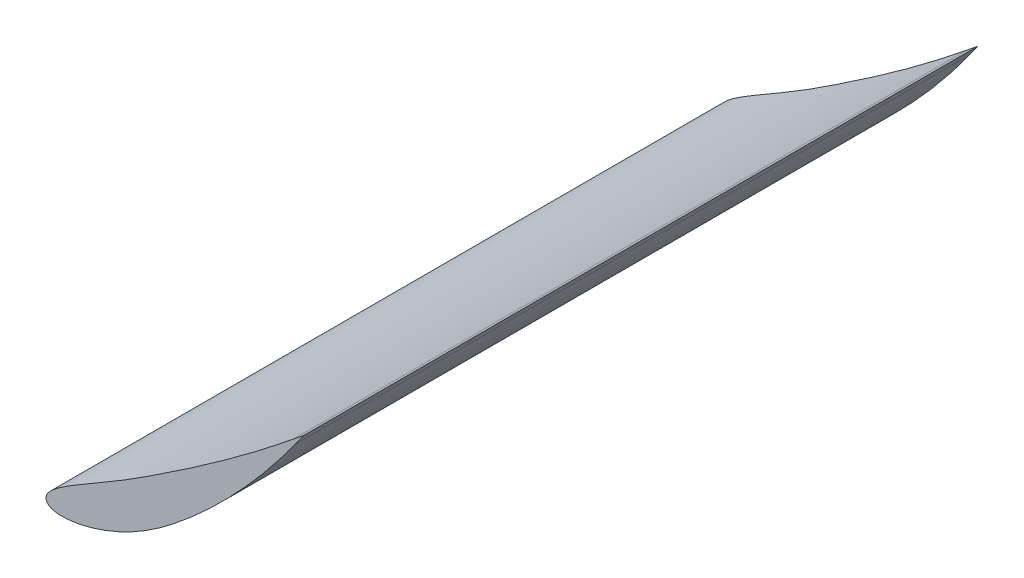
ISO-10303-21;
HEADER;
FILE_DESCRIPTION(('STEP AP214'),'2;1');
FILE_NAME('part.step','',(''),(''),'','','');
FILE_SCHEMA(('AUTOMOTIVE_DESIGN { 1 0 10303 214 1 1 1 1 }'));
ENDSEC;
DATA;
#1=APPLICATION_CONTEXT('core data for automotive mechanical design processes');
#2=APPLICATION_PROTOCOL_DEFINITION('international standard','automotive_design',2000,#1);
#3=PRODUCT_CONTEXT('',#1,'mechanical');
#4=PRODUCT('Part','Part','',(#3));
#5=PRODUCT_RELATED_PRODUCT_CATEGORY('part','',(#4));
#6=PRODUCT_DEFINITION_FORMATION('','',#4);
#7=PRODUCT_DEFINITION_CONTEXT('part definition',#1,'design');
#8=PRODUCT_DEFINITION('design','',#6,#7);
#9=PRODUCT_DEFINITION_SHAPE('','',#8);
#10=(LENGTH_UNIT() NAMED_UNIT(*) SI_UNIT(.MILLI.,.METRE.));
#11=(NAMED_UNIT(*) PLANE_ANGLE_UNIT() SI_UNIT($,.RADIAN.));
#12=(NAMED_UNIT(*) SI_UNIT($,.STERADIAN.) SOLID_ANGLE_UNIT());
#13=UNCERTAINTY_MEASURE_WITH_UNIT(LENGTH_MEASURE(1.E-05),#10,'distance_accuracy_value','');
#14=(GEOMETRIC_REPRESENTATION_CONTEXT(3) GLOBAL_UNCERTAINTY_ASSIGNED_CONTEXT((#13)) GLOBAL_UNIT_ASSIGNED_CONTEXT((#10,
#11,#12)) REPRESENTATION_CONTEXT('',''));
#15=CARTESIAN_POINT('',(0.,0.,0.));
#16=DIRECTION('',(0.,0.,1.));
#17=DIRECTION('',(1.,0.,0.));
#18=AXIS2_PLACEMENT_3D('',#15,#16,#17);
#19=CARTESIAN_POINT('',(164.392253256989,119.437963265831,431.8));
#20=DIRECTION('',(-0.811249289421057,0.584700427923419,0.));
#21=DIRECTION('',(-0.584700427923419,-0.811249289421057,0.));
#22=AXIS2_PLACEMENT_3D('',#19,#20,#21);
#23=PLANE('',#22);
#24=DIRECTION('',(0.584700427923419,0.811249289421057,0.));
#25=VECTOR('',#24,1.);
#26=CARTESIAN_POINT('',(164.392253256989,119.437963265831,0.));
#27=LINE('',#26,#25);
#28=CARTESIAN_POINT('',(158.910857997575,111.832738783564,0.));
#29=VERTEX_POINT('',#28);
#30=CARTESIAN_POINT('',(164.392253256989,119.437963265831,0.));
#31=VERTEX_POINT('',#30);
#32=EDGE_CURVE('E84',#29,#31,#27,.T.);
#33=ORIENTED_EDGE('',*,*,#32,.T.);
#34=DIRECTION('',(0.,0.,-1.));
#35=VECTOR('',#34,1.);
#36=CARTESIAN_POINT('',(164.392253256989,119.437963265831,431.8));
#37=LINE('',#36,#35);
#38=CARTESIAN_POINT('',(164.392253256989,119.437963265831,431.8));
#39=VERTEX_POINT('',#38);
#40=EDGE_CURVE('E11',#39,#31,#37,.T.);
#41=ORIENTED_EDGE('',*,*,#40,.F.);
#42=DIRECTION('',(0.584700427923419,0.811249289421057,0.));
#43=VECTOR('',#42,1.);
#44=CARTESIAN_POINT('',(164.392253256989,119.437963265831,431.8));
#45=LINE('',#44,#43);
#46=CARTESIAN_POINT('',(158.910857997575,111.832738783564,431.8));
#47=VERTEX_POINT('',#46);
#48=EDGE_CURVE('E77',#47,#39,#45,.T.);
#49=ORIENTED_EDGE('',*,*,#48,.F.);
#50=DIRECTION('',(0.,0.,-1.));
#51=VECTOR('',#50,1.);
#52=CARTESIAN_POINT('',(158.910857997575,111.832738783564,431.8));
#53=LINE('',#52,#51);
#54=EDGE_CURVE('E85',#47,#29,#53,.T.);
#55=ORIENTED_EDGE('',*,*,#54,.T.);
#56=EDGE_LOOP('',(#33,#41,#49,#55));
#57=FACE_BOUND('',#56,.T.);
#58=ADVANCED_FACE('F33',(#57),#23,.F.);
#59=CARTESIAN_POINT('',(157.468061094507,113.860792095652,431.8));
#60=DIRECTION('',(0.627285179942655,-0.778789639777206,0.));
#61=DIRECTION('',(0.778789639777206,0.627285179942655,0.));
#62=AXIS2_PLACEMENT_3D('',#59,#60,#61);
#63=PLANE('',#62);
#64=DIRECTION('',(-0.778789639777206,-0.627285179942655,0.));
#65=VECTOR('',#64,1.);
#66=CARTESIAN_POINT('',(157.468061094507,113.860792095652,0.));
#67=LINE('',#66,#65);
#68=CARTESIAN_POINT('',(157.468061094507,113.860792095652,0.));
#69=VERTEX_POINT('',#68);
#70=EDGE_CURVE('E64',#31,#69,#67,.T.);
#71=ORIENTED_EDGE('',*,*,#70,.T.);
#72=DIRECTION('',(0.,0.,-1.));
#73=VECTOR('',#72,1.);
#74=CARTESIAN_POINT('',(157.468061094507,113.860792095652,431.8));
#75=LINE('',#74,#73);
#76=CARTESIAN_POINT('',(157.468061094507,113.860792095652,431.8));
#77=VERTEX_POINT('',#76);
#78=EDGE_CURVE('E42',#77,#69,#75,.T.);
#79=ORIENTED_EDGE('',*,*,#78,.F.);
#80=DIRECTION('',(-0.778789639777206,-0.627285179942655,0.));
#81=VECTOR('',#80,1.);
#82=CARTESIAN_POINT('',(157.468061094507,113.860792095652,431.8));
#83=LINE('',#82,#81);
#84=EDGE_CURVE('E73',#39,#77,#83,.T.);
#85=ORIENTED_EDGE('',*,*,#84,.F.);
#86=ORIENTED_EDGE('',*,*,#40,.T.);
#87=EDGE_LOOP('',(#71,#79,#85,#86));
#88=FACE_BOUND('',#87,.T.);
#89=ADVANCED_FACE('F74',(#88),#63,.F.);
#90=CARTESIAN_POINT('',(157.468061094507,113.860792095652,431.8));
#91=CARTESIAN_POINT('',(155.838244249807,112.548037148124,431.8));
#92=CARTESIAN_POINT('',(154.207109491914,111.236941951689,431.8));
#93=CARTESIAN_POINT('',(150.935955142281,108.625940924506,431.8));
#94=CARTESIAN_POINT('',(149.296894116793,107.324827896361,431.8));
#95=CARTESIAN_POINT('',(144.3679662017,103.436280005174,431.8));
#96=CARTESIAN_POINT('',(141.066534858547,100.862937729253,431.8));
#97=CARTESIAN_POINT('',(131.119225282403,93.208887615958,431.8));
#98=CARTESIAN_POINT('',(124.427043210012,88.1950699424169,431.8));
#99=CARTESIAN_POINT('',(110.919196079604,78.348421372226,431.8));
#100=CARTESIAN_POINT('',(104.102895739599,73.5165215968871,431.8));
#101=CARTESIAN_POINT('',(90.3627199300965,64.0103929663063,431.8));
#102=CARTESIAN_POINT('',(83.4386673583005,59.3364236866989,431.8));
#103=CARTESIAN_POINT('',(73.0036397537534,52.3972130595375,431.8));
#104=CARTESIAN_POINT('',(69.5155707582138,50.0983987478608,431.8));
#105=CARTESIAN_POINT('',(64.2827711397147,46.6511975784364,431.8));
#106=CARTESIAN_POINT('',(62.5377824260821,45.5031889995164,431.8));
#107=CARTESIAN_POINT('',(59.0317675069052,43.2306777032786,431.8));
#108=CARTESIAN_POINT('',(57.2701955434438,42.1069748934625,431.8));
#109=CARTESIAN_POINT('',(51.9631490833563,38.7685959758256,431.8));
#110=CARTESIAN_POINT('',(48.3955320414995,36.5863737957518,431.8));
#111=CARTESIAN_POINT('',(41.2176445038925,32.2844458309126,431.8));
#112=CARTESIAN_POINT('',(37.6072124241526,30.164960489286,431.8));
#113=CARTESIAN_POINT('',(30.3704088138894,25.9494179184367,431.8));
#114=CARTESIAN_POINT('',(26.7439115716706,23.8547630738792,431.8));
#115=CARTESIAN_POINT('',(21.3275085472376,20.674960123274,431.8));
#116=CARTESIAN_POINT('',(19.526130398029,19.6083998490711,431.8));
#117=CARTESIAN_POINT('',(15.9429685471408,17.4435318595348,431.8));
#118=CARTESIAN_POINT('',(14.1607582138398,16.3459153840162,431.8));
#119=CARTESIAN_POINT('',(10.6364572105112,14.0856794954843,431.8));
#120=CARTESIAN_POINT('',(8.89318892283987,12.9249680896635,431.8));
#121=CARTESIAN_POINT('',(6.34539141965264,11.075175804667,431.8));
#122=CARTESIAN_POINT('',(5.50552298067806,10.4392660062206,431.8));
#123=CARTESIAN_POINT('',(3.87825321833517,9.11471453779397,431.8));
#124=CARTESIAN_POINT('',(3.0880036746821,8.42781382122424,431.8));
#125=CARTESIAN_POINT('',(1.97396469564981,7.32234596004794,431.8));
#126=CARTESIAN_POINT('',(1.6141433744502,6.94172073318779,431.8));
#127=CARTESIAN_POINT('',(0.930757304232876,6.14229176485067,431.8));
#128=CARTESIAN_POINT('',(0.605717377019353,5.71933499032045,431.8));
#129=CARTESIAN_POINT('',(0.0271482798685967,4.83403759399345,431.8));
#130=CARTESIAN_POINT('',(-0.226083699572971,4.37156952524479,431.8));
#131=CARTESIAN_POINT('',(-0.508234487138487,3.62415983085207,431.8));
#132=CARTESIAN_POINT('',(-0.585180280244843,3.3679212292073,431.8));
#133=CARTESIAN_POINT('',(-0.695316095914738,2.85072278821754,431.8));
#134=CARTESIAN_POINT('',(-0.729122567624853,2.58822372617473,431.8));
#135=CARTESIAN_POINT('',(-0.743022093009579,2.05337331280405,431.8));
#136=CARTESIAN_POINT('',(-0.7221915819007,1.78762282828528,431.8));
#137=CARTESIAN_POINT('',(-0.621623484133317,1.26952072283121,431.8));
#138=CARTESIAN_POINT('',(-0.541704332119032,1.0127369411627,431.8));
#139=CARTESIAN_POINT('',(-0.33175729073043,0.523081744422784,431.8));
#140=CARTESIAN_POINT('',(-0.20328706056936,0.291888774146802,431.8));
#141=CARTESIAN_POINT('',(0.0986625771133347,-0.144379322326652,431.8));
#142=CARTESIAN_POINT('',(0.273873379225597,-0.349869020660226,431.8));
#143=CARTESIAN_POINT('',(0.651108001795617,-0.721974329350371,431.8));
#144=CARTESIAN_POINT('',(0.854486148790219,-0.890971488281604,431.8));
#145=CARTESIAN_POINT('',(1.28519739954158,-1.20128690887801,431.8));
#146=CARTESIAN_POINT('',(1.51311285258183,-1.34293342947332,431.8));
#147=CARTESIAN_POINT('',(2.21105864853725,-1.72377303371843,431.8));
#148=CARTESIAN_POINT('',(2.70083601771336,-1.92240530870184,431.8));
#149=CARTESIAN_POINT('',(3.71043442050406,-2.2518502054561,431.8));
#150=CARTESIAN_POINT('',(4.22618496415132,-2.38116367984013,431.8));
#151=CARTESIAN_POINT('',(5.26308558305631,-2.58656443356782,431.8));
#152=CARTESIAN_POINT('',(5.78603261217279,-2.66399796110731,431.8));
#153=CARTESIAN_POINT('',(6.83828950899693,-2.78311253527516,431.8));
#154=CARTESIAN_POINT('',(7.36823397887924,-2.82392166804276,431.8));
#155=CARTESIAN_POINT('',(8.42297093110776,-2.87640465835309,431.8));
#156=CARTESIAN_POINT('',(8.94926091892882,-2.88865896781911,431.8));
#157=CARTESIAN_POINT('',(10.525508866839,-2.8914163176165,431.8));
#158=CARTESIAN_POINT('',(11.5728412463359,-2.8478675434574,431.8));
#159=CARTESIAN_POINT('',(13.6626655190764,-2.69799251254851,431.8));
#160=CARTESIAN_POINT('',(14.705068864797,-2.59051786071742,431.8));
#161=CARTESIAN_POINT('',(16.7860082830142,-2.32541291880544,431.8));
#162=CARTESIAN_POINT('',(17.8245151647431,-2.1674040463162,431.8));
#163=CARTESIAN_POINT('',(19.8981776322375,-1.8079225018375,431.8));
#164=CARTESIAN_POINT('',(20.9334772701192,-1.60656097457819,431.8));
#165=CARTESIAN_POINT('',(24.0168342761845,-0.94896759567361,431.8));
#166=CARTESIAN_POINT('',(26.0492811976918,-0.439097516502388,431.8));
#167=CARTESIAN_POINT('',(32.0899519377952,1.26567222772899,431.8));
#168=CARTESIAN_POINT('',(36.0420522311614,2.63404224321699,431.8));
#169=CARTESIAN_POINT('',(41.8788925912185,4.96882457681439,431.8));
#170=CARTESIAN_POINT('',(43.8119429935888,5.79614070409062,431.8));
#171=CARTESIAN_POINT('',(47.6353874669602,7.53492212804651,431.8));
#172=CARTESIAN_POINT('',(49.5210623664358,8.44408839800671,431.8));
#173=CARTESIAN_POINT('',(55.1056901539949,11.2821408319546,431.8));
#174=CARTESIAN_POINT('',(58.7324353378502,13.3212916922179,431.8));
#175=CARTESIAN_POINT('',(65.8130963319883,17.6635123198495,431.8));
#176=CARTESIAN_POINT('',(69.2671684904961,19.9663433358309,431.8));
#177=CARTESIAN_POINT('',(76.0148092322926,24.8171021779162,431.8));
#178=CARTESIAN_POINT('',(79.301584899193,27.3754031196094,431.8));
#179=CARTESIAN_POINT('',(84.1779853694685,31.2949533088022,431.8));
#180=CARTESIAN_POINT('',(85.7928071713274,32.6177255071486,431.8));
#181=CARTESIAN_POINT('',(89.0003331811582,35.2970445515515,431.8));
#182=CARTESIAN_POINT('',(90.5921240680383,36.6525068731581,431.8));
#183=CARTESIAN_POINT('',(98.4773217467177,43.4875724221723,431.8));
#184=CARTESIAN_POINT('',(104.568115369873,49.1545537694427,431.8));
#185=CARTESIAN_POINT('',(116.378873198927,60.8278942572071,431.8));
#186=CARTESIAN_POINT('',(122.098231746913,66.8348076871842,431.8));
#187=CARTESIAN_POINT('',(133.196506361703,79.1602026499015,431.8));
#188=CARTESIAN_POINT('',(138.57488037448,85.4791802627562,431.8));
#189=CARTESIAN_POINT('',(146.391356471631,95.1874360212316,431.8));
#190=CARTESIAN_POINT('',(148.954675272111,98.4621176143427,431.8));
#191=CARTESIAN_POINT('',(152.73616863268,103.432240424179,431.8));
#192=CARTESIAN_POINT('',(153.986024632667,105.098687239007,431.8));
#193=CARTESIAN_POINT('',(156.464325589675,108.451175949785,431.8));
#194=CARTESIAN_POINT('',(157.690394330957,110.139392524482,431.8));
#195=CARTESIAN_POINT('',(158.910857997575,111.832738783564,431.8));
#196=B_SPLINE_CURVE_WITH_KNOTS('',3,(#90,#91,#92,#93,#94,#95,#96,#97,#98,#99,#100,#101,#102,
#103,#104,#105,#106,#107,#108,#109,#110,#111,#112,#113,#114,#115,#116,#117,#118,#119,#120,#121,
#122,#123,#124,#125,#126,#127,#128,#129,#130,#131,#132,#133,#134,#135,#136,#137,#138,#139,#140,
#141,#142,#143,#144,#145,#146,#147,#148,#149,#150,#151,#152,#153,#154,#155,#156,#157,#158,#159,
#160,#161,#162,#163,#164,#165,#166,#167,#168,#169,#170,#171,#172,#173,#174,#175,#176,#177,#178,
#179,#180,#181,#182,#183,#184,#185,#186,#187,#188,#189,#190,#191,#192,#193,#194,#195),
.UNSPECIFIED.,.F.,.F.,(4,2,2,2,2,2,2,2,2,2,2,2,2,2,2,2,2,2,2,2,2,2,2,2,2,2,2,2,2,2,2,2,2,2,2,2,
2,2,2,2,2,2,2,2,2,2,2,2,2,2,2,2,4),(0.,0.0156250000000021,0.0312500000000041,0.0625000000000074,
0.125000000000013,0.187500000000019,0.250000000000025,0.281250000000028,0.29687500000003,
0.312500000000031,0.343750000000034,0.375000000000038,0.406250000000041,0.421875000000042,
0.437500000000043,0.453125000000045,0.460937500000045,0.468750000000046,0.472656250000046,
0.476562500000047,0.480468750000047,0.482421875000047,0.484375000000047,0.486328125000047,
0.488281250000047,0.490234375000047,0.492187500000047,0.494140625000047,0.496093750000047,
0.500000000000047,0.503906250000047,0.507812500000047,0.511718750000046,0.515625000000046,
0.523437500000045,0.531250000000044,0.539062500000044,0.546875000000043,0.562500000000041,
0.593750000000038,0.609375000000036,0.625000000000034,0.656250000000031,0.687500000000028,
0.718750000000026,0.734375000000024,0.750000000000023,0.812500000000017,0.875000000000011,
0.937500000000006,0.968750000000003,0.984375000000001,1.),.UNSPECIFIED.);
#197=DIRECTION('',(0.,0.,-1.));
#198=VECTOR('',#197,1.);
#199=SURFACE_OF_LINEAR_EXTRUSION('',#196,#198);
#200=CARTESIAN_POINT('',(157.468061094507,113.860792095652,0.));
#201=CARTESIAN_POINT('',(155.838244249807,112.548037148124,0.));
#202=CARTESIAN_POINT('',(154.207109491914,111.236941951689,0.));
#203=CARTESIAN_POINT('',(150.935955142281,108.625940924506,0.));
#204=CARTESIAN_POINT('',(149.296894116793,107.324827896361,0.));
#205=CARTESIAN_POINT('',(144.3679662017,103.436280005174,0.));
#206=CARTESIAN_POINT('',(141.066534858547,100.862937729253,0.));
#207=CARTESIAN_POINT('',(131.119225282403,93.208887615958,0.));
#208=CARTESIAN_POINT('',(124.427043210012,88.1950699424169,0.));
#209=CARTESIAN_POINT('',(110.919196079604,78.348421372226,0.));
#210=CARTESIAN_POINT('',(104.102895739599,73.5165215968871,0.));
#211=CARTESIAN_POINT('',(90.3627199300965,64.0103929663063,0.));
#212=CARTESIAN_POINT('',(83.4386673583005,59.3364236866989,0.));
#213=CARTESIAN_POINT('',(73.0036397537534,52.3972130595375,0.));
#214=CARTESIAN_POINT('',(69.5155707582138,50.0983987478608,0.));
#215=CARTESIAN_POINT('',(64.2827711397147,46.6511975784364,0.));
#216=CARTESIAN_POINT('',(62.5377824260821,45.5031889995164,0.));
#217=CARTESIAN_POINT('',(59.0317675069052,43.2306777032786,0.));
#218=CARTESIAN_POINT('',(57.2701955434438,42.1069748934625,0.));
#219=CARTESIAN_POINT('',(51.9631490833563,38.7685959758256,0.));
#220=CARTESIAN_POINT('',(48.3955320414995,36.5863737957518,0.));
#221=CARTESIAN_POINT('',(41.2176445038925,32.2844458309126,0.));
#222=CARTESIAN_POINT('',(37.6072124241526,30.164960489286,0.));
#223=CARTESIAN_POINT('',(30.3704088138894,25.9494179184367,0.));
#224=CARTESIAN_POINT('',(26.7439115716706,23.8547630738792,0.));
#225=CARTESIAN_POINT('',(21.3275085472376,20.674960123274,0.));
#226=CARTESIAN_POINT('',(19.526130398029,19.6083998490711,0.));
#227=CARTESIAN_POINT('',(15.9429685471408,17.4435318595348,0.));
#228=CARTESIAN_POINT('',(14.1607582138398,16.3459153840162,0.));
#229=CARTESIAN_POINT('',(10.6364572105112,14.0856794954843,0.));
#230=CARTESIAN_POINT('',(8.89318892283987,12.9249680896635,0.));
#231=CARTESIAN_POINT('',(6.34539141965264,11.075175804667,0.));
#232=CARTESIAN_POINT('',(5.50552298067806,10.4392660062206,0.));
#233=CARTESIAN_POINT('',(3.87825321833517,9.11471453779397,0.));
#234=CARTESIAN_POINT('',(3.0880036746821,8.42781382122424,0.));
#235=CARTESIAN_POINT('',(1.97396469564981,7.32234596004794,0.));
#236=CARTESIAN_POINT('',(1.6141433744502,6.94172073318779,0.));
#237=CARTESIAN_POINT('',(0.930757304232876,6.14229176485067,0.));
#238=CARTESIAN_POINT('',(0.605717377019353,5.71933499032045,0.));
#239=CARTESIAN_POINT('',(0.0271482798685967,4.83403759399345,0.));
#240=CARTESIAN_POINT('',(-0.226083699572971,4.37156952524479,0.));
#241=CARTESIAN_POINT('',(-0.508234487138487,3.62415983085207,0.));
#242=CARTESIAN_POINT('',(-0.585180280244843,3.3679212292073,0.));
#243=CARTESIAN_POINT('',(-0.695316095914738,2.85072278821754,0.));
#244=CARTESIAN_POINT('',(-0.729122567624853,2.58822372617473,0.));
#245=CARTESIAN_POINT('',(-0.743022093009579,2.05337331280405,0.));
#246=CARTESIAN_POINT('',(-0.7221915819007,1.78762282828528,0.));
#247=CARTESIAN_POINT('',(-0.621623484133317,1.26952072283121,0.));
#248=CARTESIAN_POINT('',(-0.541704332119032,1.0127369411627,0.));
#249=CARTESIAN_POINT('',(-0.33175729073043,0.523081744422784,0.));
#250=CARTESIAN_POINT('',(-0.20328706056936,0.291888774146802,0.));
#251=CARTESIAN_POINT('',(0.0986625771133347,-0.144379322326652,0.));
#252=CARTESIAN_POINT('',(0.273873379225597,-0.349869020660226,0.));
#253=CARTESIAN_POINT('',(0.651108001795617,-0.721974329350371,0.));
#254=CARTESIAN_POINT('',(0.854486148790219,-0.890971488281604,0.));
#255=CARTESIAN_POINT('',(1.28519739954158,-1.20128690887801,0.));
#256=CARTESIAN_POINT('',(1.51311285258183,-1.34293342947332,0.));
#257=CARTESIAN_POINT('',(2.21105864853725,-1.72377303371843,0.));
#258=CARTESIAN_POINT('',(2.70083601771336,-1.92240530870184,0.));
#259=CARTESIAN_POINT('',(3.71043442050406,-2.2518502054561,0.));
#260=CARTESIAN_POINT('',(4.22618496415132,-2.38116367984013,0.));
#261=CARTESIAN_POINT('',(5.26308558305631,-2.58656443356782,0.));
#262=CARTESIAN_POINT('',(5.78603261217279,-2.66399796110731,0.));
#263=CARTESIAN_POINT('',(6.83828950899693,-2.78311253527516,0.));
#264=CARTESIAN_POINT('',(7.36823397887924,-2.82392166804276,0.));
#265=CARTESIAN_POINT('',(8.42297093110776,-2.87640465835309,0.));
#266=CARTESIAN_POINT('',(8.94926091892882,-2.88865896781911,0.));
#267=CARTESIAN_POINT('',(10.525508866839,-2.8914163176165,0.));
#268=CARTESIAN_POINT('',(11.5728412463359,-2.8478675434574,0.));
#269=CARTESIAN_POINT('',(13.6626655190764,-2.69799251254851,0.));
#270=CARTESIAN_POINT('',(14.705068864797,-2.59051786071742,0.));
#271=CARTESIAN_POINT('',(16.7860082830142,-2.32541291880544,0.));
#272=CARTESIAN_POINT('',(17.8245151647431,-2.1674040463162,0.));
#273=CARTESIAN_POINT('',(19.8981776322375,-1.8079225018375,0.));
#274=CARTESIAN_POINT('',(20.9334772701192,-1.60656097457819,0.));
#275=CARTESIAN_POINT('',(24.0168342761845,-0.94896759567361,0.));
#276=CARTESIAN_POINT('',(26.0492811976918,-0.439097516502388,0.));
#277=CARTESIAN_POINT('',(32.0899519377952,1.26567222772899,0.));
#278=CARTESIAN_POINT('',(36.0420522311614,2.63404224321699,0.));
#279=CARTESIAN_POINT('',(41.8788925912185,4.96882457681439,0.));
#280=CARTESIAN_POINT('',(43.8119429935888,5.79614070409062,0.));
#281=CARTESIAN_POINT('',(47.6353874669602,7.53492212804651,0.));
#282=CARTESIAN_POINT('',(49.5210623664358,8.44408839800671,0.));
#283=CARTESIAN_POINT('',(55.1056901539949,11.2821408319546,0.));
#284=CARTESIAN_POINT('',(58.7324353378502,13.3212916922179,0.));
#285=CARTESIAN_POINT('',(65.8130963319883,17.6635123198495,0.));
#286=CARTESIAN_POINT('',(69.2671684904961,19.9663433358309,0.));
#287=CARTESIAN_POINT('',(76.0148092322926,24.8171021779162,0.));
#288=CARTESIAN_POINT('',(79.301584899193,27.3754031196094,0.));
#289=CARTESIAN_POINT('',(84.1779853694685,31.2949533088022,0.));
#290=CARTESIAN_POINT('',(85.7928071713274,32.6177255071486,0.));
#291=CARTESIAN_POINT('',(89.0003331811582,35.2970445515515,0.));
#292=CARTESIAN_POINT('',(90.5921240680383,36.6525068731581,0.));
#293=CARTESIAN_POINT('',(98.4773217467177,43.4875724221723,0.));
#294=CARTESIAN_POINT('',(104.568115369873,49.1545537694427,0.));
#295=CARTESIAN_POINT('',(116.378873198927,60.8278942572071,0.));
#296=CARTESIAN_POINT('',(122.098231746913,66.8348076871842,0.));
#297=CARTESIAN_POINT('',(133.196506361703,79.1602026499015,0.));
#298=CARTESIAN_POINT('',(138.57488037448,85.4791802627562,0.));
#299=CARTESIAN_POINT('',(146.391356471631,95.1874360212316,0.));
#300=CARTESIAN_POINT('',(148.954675272111,98.4621176143427,0.));
#301=CARTESIAN_POINT('',(152.73616863268,103.432240424179,0.));
#302=CARTESIAN_POINT('',(153.986024632667,105.098687239007,0.));
#303=CARTESIAN_POINT('',(156.464325589675,108.451175949785,0.));
#304=CARTESIAN_POINT('',(157.690394330957,110.139392524482,0.));
#305=CARTESIAN_POINT('',(158.910857997575,111.832738783564,0.));
#306=B_SPLINE_CURVE_WITH_KNOTS('',3,(#200,#201,#202,#203,#204,#205,#206,#207,#208,#209,#210,
#211,#212,#213,#214,#215,#216,#217,#218,#219,#220,#221,#222,#223,#224,#225,#226,#227,#228,#229,
#230,#231,#232,#233,#234,#235,#236,#237,#238,#239,#240,#241,#242,#243,#244,#245,#246,#247,#248,
#249,#250,#251,#252,#253,#254,#255,#256,#257,#258,#259,#260,#261,#262,#263,#264,#265,#266,#267,
#268,#269,#270,#271,#272,#273,#274,#275,#276,#277,#278,#279,#280,#281,#282,#283,#284,#285,#286,
#287,#288,#289,#290,#291,#292,#293,#294,#295,#296,#297,#298,#299,#300,#301,#302,#303,#304,#305),
.UNSPECIFIED.,.F.,.F.,(4,2,2,2,2,2,2,2,2,2,2,2,2,2,2,2,2,2,2,2,2,2,2,2,2,2,2,2,2,2,2,2,2,2,2,2,
2,2,2,2,2,2,2,2,2,2,2,2,2,2,2,2,4),(0.,0.0156250000000021,0.0312500000000041,0.0625000000000074,
0.125000000000013,0.187500000000019,0.250000000000025,0.281250000000028,0.29687500000003,
0.312500000000031,0.343750000000034,0.375000000000038,0.406250000000041,0.421875000000042,
0.437500000000043,0.453125000000045,0.460937500000045,0.468750000000046,0.472656250000046,
0.476562500000047,0.480468750000047,0.482421875000047,0.484375000000047,0.486328125000047,
0.488281250000047,0.490234375000047,0.492187500000047,0.494140625000047,0.496093750000047,
0.500000000000047,0.503906250000047,0.507812500000047,0.511718750000046,0.515625000000046,
0.523437500000045,0.531250000000044,0.539062500000044,0.546875000000043,0.562500000000041,
0.593750000000038,0.609375000000036,0.625000000000034,0.656250000000031,0.687500000000028,
0.718750000000026,0.734375000000024,0.750000000000023,0.812500000000017,0.875000000000011,
0.937500000000006,0.968750000000003,0.984375000000001,1.),.UNSPECIFIED.);
#307=EDGE_CURVE('E69',#69,#29,#306,.T.);
#308=ORIENTED_EDGE('',*,*,#307,.T.);
#309=ORIENTED_EDGE('',*,*,#54,.F.);
#310=CARTESIAN_POINT('',(158.910857997575,111.832738783564,431.8));
#311=CARTESIAN_POINT('',(157.690394330957,110.139392524482,431.8));
#312=CARTESIAN_POINT('',(156.464325589675,108.451175949785,431.8));
#313=CARTESIAN_POINT('',(153.986024632667,105.098687239007,431.8));
#314=CARTESIAN_POINT('',(152.73616863268,103.432240424179,431.8));
#315=CARTESIAN_POINT('',(148.954675272111,98.4621176143427,431.8));
#316=CARTESIAN_POINT('',(146.391356471631,95.1874360212316,431.8));
#317=CARTESIAN_POINT('',(138.57488037448,85.4791802627562,431.8));
#318=CARTESIAN_POINT('',(133.196506361703,79.1602026499015,431.8));
#319=CARTESIAN_POINT('',(122.098231746913,66.8348076871842,431.8));
#320=CARTESIAN_POINT('',(116.378873198927,60.8278942572071,431.8));
#321=CARTESIAN_POINT('',(104.568115369873,49.1545537694427,431.8));
#322=CARTESIAN_POINT('',(98.4773217467177,43.4875724221723,431.8));
#323=CARTESIAN_POINT('',(90.5921240680383,36.6525068731581,431.8));
#324=CARTESIAN_POINT('',(89.0003331811582,35.2970445515515,431.8));
#325=CARTESIAN_POINT('',(85.7928071713274,32.6177255071486,431.8));
#326=CARTESIAN_POINT('',(84.1779853694685,31.2949533088022,431.8));
#327=CARTESIAN_POINT('',(79.301584899193,27.3754031196094,431.8));
#328=CARTESIAN_POINT('',(76.0148092322926,24.8171021779162,431.8));
#329=CARTESIAN_POINT('',(69.2671684904961,19.9663433358309,431.8));
#330=CARTESIAN_POINT('',(65.8130963319883,17.6635123198495,431.8));
#331=CARTESIAN_POINT('',(58.7324353378502,13.3212916922179,431.8));
#332=CARTESIAN_POINT('',(55.1056901539949,11.2821408319546,431.8));
#333=CARTESIAN_POINT('',(49.5210623664358,8.44408839800671,431.8));
#334=CARTESIAN_POINT('',(47.6353874669602,7.53492212804651,431.8));
#335=CARTESIAN_POINT('',(43.8119429935888,5.79614070409062,431.8));
#336=CARTESIAN_POINT('',(41.8788925912185,4.96882457681439,431.8));
#337=CARTESIAN_POINT('',(36.0420522311614,2.63404224321699,431.8));
#338=CARTESIAN_POINT('',(32.0899519377952,1.26567222772899,431.8));
#339=CARTESIAN_POINT('',(26.0492811976918,-0.439097516502388,431.8));
#340=CARTESIAN_POINT('',(24.0168342761845,-0.94896759567361,431.8));
#341=CARTESIAN_POINT('',(20.9334772701192,-1.60656097457819,431.8));
#342=CARTESIAN_POINT('',(19.8981776322375,-1.8079225018375,431.8));
#343=CARTESIAN_POINT('',(17.8245151647431,-2.1674040463162,431.8));
#344=CARTESIAN_POINT('',(16.7860082830142,-2.32541291880544,431.8));
#345=CARTESIAN_POINT('',(14.705068864797,-2.59051786071742,431.8));
#346=CARTESIAN_POINT('',(13.6626655190764,-2.69799251254851,431.8));
#347=CARTESIAN_POINT('',(11.5728412463359,-2.8478675434574,431.8));
#348=CARTESIAN_POINT('',(10.525508866839,-2.8914163176165,431.8));
#349=CARTESIAN_POINT('',(8.94926091892882,-2.88865896781911,431.8));
#350=CARTESIAN_POINT('',(8.42297093110776,-2.87640465835309,431.8));
#351=CARTESIAN_POINT('',(7.36823397887924,-2.82392166804276,431.8));
#352=CARTESIAN_POINT('',(6.83828950899693,-2.78311253527516,431.8));
#353=CARTESIAN_POINT('',(5.78603261217279,-2.66399796110731,431.8));
#354=CARTESIAN_POINT('',(5.26308558305631,-2.58656443356782,431.8));
#355=CARTESIAN_POINT('',(4.22618496415132,-2.38116367984013,431.8));
#356=CARTESIAN_POINT('',(3.71043442050406,-2.2518502054561,431.8));
#357=CARTESIAN_POINT('',(2.70083601771336,-1.92240530870184,431.8));
#358=CARTESIAN_POINT('',(2.21105864853725,-1.72377303371843,431.8));
#359=CARTESIAN_POINT('',(1.51311285258183,-1.34293342947332,431.8));
#360=CARTESIAN_POINT('',(1.28519739954158,-1.20128690887801,431.8));
#361=CARTESIAN_POINT('',(0.854486148790219,-0.890971488281604,431.8));
#362=CARTESIAN_POINT('',(0.651108001795617,-0.721974329350371,431.8));
#363=CARTESIAN_POINT('',(0.273873379225597,-0.349869020660226,431.8));
#364=CARTESIAN_POINT('',(0.0986625771133347,-0.144379322326652,431.8));
#365=CARTESIAN_POINT('',(-0.20328706056936,0.291888774146802,431.8));
#366=CARTESIAN_POINT('',(-0.33175729073043,0.523081744422784,431.8));
#367=CARTESIAN_POINT('',(-0.541704332119032,1.0127369411627,431.8));
#368=CARTESIAN_POINT('',(-0.621623484133317,1.26952072283121,431.8));
#369=CARTESIAN_POINT('',(-0.7221915819007,1.78762282828528,431.8));
#370=CARTESIAN_POINT('',(-0.743022093009579,2.05337331280405,431.8));
#371=CARTESIAN_POINT('',(-0.729122567624853,2.58822372617473,431.8));
#372=CARTESIAN_POINT('',(-0.695316095914738,2.85072278821754,431.8));
#373=CARTESIAN_POINT('',(-0.585180280244843,3.3679212292073,431.8));
#374=CARTESIAN_POINT('',(-0.508234487138487,3.62415983085207,431.8));
#375=CARTESIAN_POINT('',(-0.226083699572971,4.37156952524479,431.8));
#376=CARTESIAN_POINT('',(0.0271482798685967,4.83403759399345,431.8));
#377=CARTESIAN_POINT('',(0.605717377019353,5.71933499032045,431.8));
#378=CARTESIAN_POINT('',(0.930757304232876,6.14229176485067,431.8));
#379=CARTESIAN_POINT('',(1.6141433744502,6.94172073318779,431.8));
#380=CARTESIAN_POINT('',(1.97396469564981,7.32234596004794,431.8));
#381=CARTESIAN_POINT('',(3.0880036746821,8.42781382122424,431.8));
#382=CARTESIAN_POINT('',(3.87825321833517,9.11471453779397,431.8));
#383=CARTESIAN_POINT('',(5.50552298067806,10.4392660062206,431.8));
#384=CARTESIAN_POINT('',(6.34539141965264,11.075175804667,431.8));
#385=CARTESIAN_POINT('',(8.89318892283987,12.9249680896635,431.8));
#386=CARTESIAN_POINT('',(10.6364572105112,14.0856794954843,431.8));
#387=CARTESIAN_POINT('',(14.1607582138398,16.3459153840162,431.8));
#388=CARTESIAN_POINT('',(15.9429685471408,17.4435318595348,431.8));
#389=CARTESIAN_POINT('',(19.526130398029,19.6083998490711,431.8));
#390=CARTESIAN_POINT('',(21.3275085472376,20.674960123274,431.8));
#391=CARTESIAN_POINT('',(26.7439115716706,23.8547630738792,431.8));
#392=CARTESIAN_POINT('',(30.3704088138894,25.9494179184367,431.8));
#393=CARTESIAN_POINT('',(37.6072124241526,30.164960489286,431.8));
#394=CARTESIAN_POINT('',(41.2176445038925,32.2844458309126,431.8));
#395=CARTESIAN_POINT('',(48.3955320414995,36.5863737957518,431.8));
#396=CARTESIAN_POINT('',(51.9631490833563,38.7685959758256,431.8));
#397=CARTESIAN_POINT('',(57.2701955434438,42.1069748934625,431.8));
#398=CARTESIAN_POINT('',(59.0317675069052,43.2306777032786,431.8));
#399=CARTESIAN_POINT('',(62.5377824260821,45.5031889995164,431.8));
#400=CARTESIAN_POINT('',(64.2827711397147,46.6511975784364,431.8));
#401=CARTESIAN_POINT('',(69.5155707582138,50.0983987478608,431.8));
#402=CARTESIAN_POINT('',(73.0036397537534,52.3972130595375,431.8));
#403=CARTESIAN_POINT('',(83.4386673583005,59.3364236866989,431.8));
#404=CARTESIAN_POINT('',(90.3627199300965,64.0103929663063,431.8));
#405=CARTESIAN_POINT('',(104.102895739599,73.5165215968871,431.8));
#406=CARTESIAN_POINT('',(110.919196079604,78.348421372226,431.8));
#407=CARTESIAN_POINT('',(124.427043210012,88.1950699424169,431.8));
#408=CARTESIAN_POINT('',(131.119225282403,93.208887615958,431.8));
#409=CARTESIAN_POINT('',(141.066534858547,100.862937729253,431.8));
#410=CARTESIAN_POINT('',(144.3679662017,103.436280005174,431.8));
#411=CARTESIAN_POINT('',(149.296894116793,107.324827896361,431.8));
#412=CARTESIAN_POINT('',(150.935955142281,108.625940924506,431.8));
#413=CARTESIAN_POINT('',(154.207109491914,111.236941951689,431.8));
#414=CARTESIAN_POINT('',(155.838244249807,112.548037148124,431.8));
#415=CARTESIAN_POINT('',(157.468061094507,113.860792095652,431.8));
#416=B_SPLINE_CURVE_WITH_KNOTS('',3,(#310,#311,#312,#313,#314,#315,#316,#317,#318,#319,#320,
#321,#322,#323,#324,#325,#326,#327,#328,#329,#330,#331,#332,#333,#334,#335,#336,#337,#338,#339,
#340,#341,#342,#343,#344,#345,#346,#347,#348,#349,#350,#351,#352,#353,#354,#355,#356,#357,#358,
#359,#360,#361,#362,#363,#364,#365,#366,#367,#368,#369,#370,#371,#372,#373,#374,#375,#376,#377,
#378,#379,#380,#381,#382,#383,#384,#385,#386,#387,#388,#389,#390,#391,#392,#393,#394,#395,#396,
#397,#398,#399,#400,#401,#402,#403,#404,#405,#406,#407,#408,#409,#410,#411,#412,#413,#414,#415),
.UNSPECIFIED.,.F.,.F.,(4,2,2,2,2,2,2,2,2,2,2,2,2,2,2,2,2,2,2,2,2,2,2,2,2,2,2,2,2,2,2,2,2,2,2,2,
2,2,2,2,2,2,2,2,2,2,2,2,2,2,2,2,4),(0.,0.0156249999999987,0.0312499999999972,0.0624999999999943,
0.124999999999989,0.187499999999983,0.249999999999977,0.265624999999976,0.281249999999974,
0.312499999999972,0.343749999999969,0.374999999999966,0.390624999999964,0.406249999999962,
0.437499999999959,0.453124999999957,0.460937499999956,0.468749999999956,0.476562499999955,
0.484374999999954,0.488281249999954,0.492187499999953,0.496093749999953,0.499999999999953,
0.503906249999953,0.505859374999953,0.507812499999953,0.509765624999953,0.511718749999953,
0.513671874999953,0.515624999999953,0.517578124999953,0.519531249999953,0.523437499999953,
0.527343749999954,0.531249999999954,0.539062499999955,0.546874999999955,0.562499999999957,
0.578124999999958,0.593749999999959,0.624999999999962,0.656249999999966,0.687499999999969,
0.70312499999997,0.718749999999972,0.749999999999975,0.812499999999981,0.874999999999987,
0.937499999999993,0.968749999999996,0.984374999999998,1.),.UNSPECIFIED.);
#417=EDGE_CURVE('E51',#77,#47,#416,.F.);
#418=ORIENTED_EDGE('',*,*,#417,.F.);
#419=ORIENTED_EDGE('',*,*,#78,.T.);
#420=EDGE_LOOP('',(#308,#309,#418,#419));
#421=FACE_BOUND('',#420,.T.);
#422=ADVANCED_FACE('F107',(#421),#199,.F.);
#423=CARTESIAN_POINT('',(3.20563521909042,-2.087127757073,431.8));
#424=DIRECTION('',(0.,0.,1.));
#425=DIRECTION('',(1.,0.,0.));
#426=AXIS2_PLACEMENT_3D('',#423,#424,#425);
#427=PLANE('',#426);
#428=ORIENTED_EDGE('',*,*,#48,.T.);
#429=ORIENTED_EDGE('',*,*,#84,.T.);
#430=ORIENTED_EDGE('',*,*,#417,.T.);
#431=EDGE_LOOP('',(#428,#429,#430));
#432=FACE_BOUND('',#431,.T.);
#433=ADVANCED_FACE('F80',(#432),#427,.T.);
#434=CARTESIAN_POINT('',(3.20563521909042,-2.087127757073,0.));
#435=DIRECTION('',(0.,0.,1.));
#436=DIRECTION('',(1.,0.,0.));
#437=AXIS2_PLACEMENT_3D('',#434,#435,#436);
#438=PLANE('',#437);
#439=ORIENTED_EDGE('',*,*,#32,.F.);
#440=ORIENTED_EDGE('',*,*,#307,.F.);
#441=ORIENTED_EDGE('',*,*,#70,.F.);
#442=EDGE_LOOP('',(#439,#440,#441));
#443=FACE_BOUND('',#442,.T.);
#444=ADVANCED_FACE('F96',(#443),#438,.F.);
#445=CLOSED_SHELL('',(#58,#89,#422,#433,#444));
#446=MANIFOLD_SOLID_BREP('B2',#445);
#447=ADVANCED_BREP_SHAPE_REPRESENTATION('',(#18,#446),#14);
#448=SHAPE_DEFINITION_REPRESENTATION(#9,#447);
ENDSEC;
END-ISO-10303-21;
